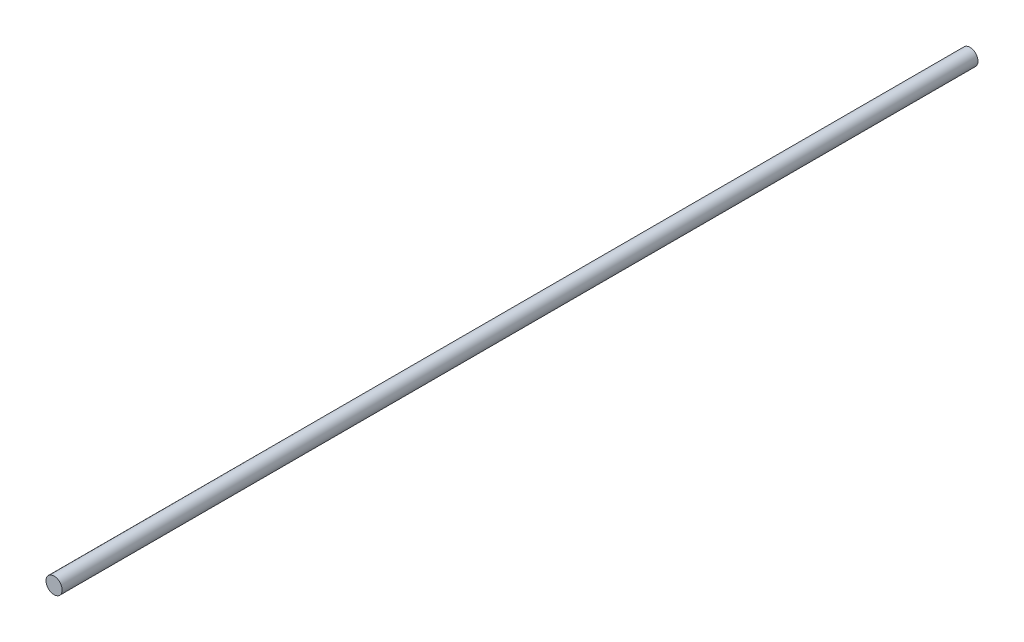
ISO-10303-21;
HEADER;
FILE_DESCRIPTION(('STEP AP214'),'2;1');
FILE_NAME('part.step','',(''),(''),'','','');
FILE_SCHEMA(('AUTOMOTIVE_DESIGN { 1 0 10303 214 1 1 1 1 }'));
ENDSEC;
DATA;
#1=APPLICATION_CONTEXT('core data for automotive mechanical design processes');
#2=APPLICATION_PROTOCOL_DEFINITION('international standard','automotive_design',2000,#1);
#3=PRODUCT_CONTEXT('',#1,'mechanical');
#4=PRODUCT('Part','Part','',(#3));
#5=PRODUCT_RELATED_PRODUCT_CATEGORY('part','',(#4));
#6=PRODUCT_DEFINITION_FORMATION('','',#4);
#7=PRODUCT_DEFINITION_CONTEXT('part definition',#1,'design');
#8=PRODUCT_DEFINITION('design','',#6,#7);
#9=PRODUCT_DEFINITION_SHAPE('','',#8);
#10=(LENGTH_UNIT() NAMED_UNIT(*) SI_UNIT(.MILLI.,.METRE.));
#11=(NAMED_UNIT(*) PLANE_ANGLE_UNIT() SI_UNIT($,.RADIAN.));
#12=(NAMED_UNIT(*) SI_UNIT($,.STERADIAN.) SOLID_ANGLE_UNIT());
#13=UNCERTAINTY_MEASURE_WITH_UNIT(LENGTH_MEASURE(1.E-05),#10,'distance_accuracy_value','');
#14=(GEOMETRIC_REPRESENTATION_CONTEXT(3) GLOBAL_UNCERTAINTY_ASSIGNED_CONTEXT((#13)) GLOBAL_UNIT_ASSIGNED_CONTEXT((#10,
#11,#12)) REPRESENTATION_CONTEXT('',''));
#15=CARTESIAN_POINT('',(0.,0.,0.));
#16=DIRECTION('',(0.,0.,1.));
#17=DIRECTION('',(1.,0.,0.));
#18=AXIS2_PLACEMENT_3D('',#15,#16,#17);
#19=CARTESIAN_POINT('',(0.,0.,680.));
#20=DIRECTION('',(0.,0.,-1.));
#21=DIRECTION('',(-1.,0.,0.));
#22=AXIS2_PLACEMENT_3D('',#19,#20,#21);
#23=CYLINDRICAL_SURFACE('',#22,6.);
#24=CARTESIAN_POINT('',(0.,0.,680.));
#25=DIRECTION('',(0.,0.,1.));
#26=DIRECTION('',(1.,0.,0.));
#27=AXIS2_PLACEMENT_3D('',#24,#25,#26);
#28=CIRCLE('',#27,6.);
#29=CARTESIAN_POINT('',(6.,0.,680.));
#30=VERTEX_POINT('',#29);
#31=EDGE_CURVE('E10',#30,#30,#28,.T.);
#32=ORIENTED_EDGE('',*,*,#31,.F.);
#33=EDGE_LOOP('',(#32));
#34=FACE_BOUND('',#33,.T.);
#35=CARTESIAN_POINT('',(0.,0.,0.));
#36=DIRECTION('',(0.,0.,1.));
#37=DIRECTION('',(1.,0.,0.));
#38=AXIS2_PLACEMENT_3D('',#35,#36,#37);
#39=CIRCLE('',#38,6.);
#40=CARTESIAN_POINT('',(6.,0.,0.));
#41=VERTEX_POINT('',#40);
#42=EDGE_CURVE('E46',#41,#41,#39,.T.);
#43=ORIENTED_EDGE('',*,*,#42,.T.);
#44=EDGE_LOOP('',(#43));
#45=FACE_BOUND('',#44,.T.);
#46=ADVANCED_FACE('F43',(#34,#45),#23,.T.);
#47=CARTESIAN_POINT('',(0.,0.,680.));
#48=DIRECTION('',(0.,0.,1.));
#49=DIRECTION('',(1.,0.,0.));
#50=AXIS2_PLACEMENT_3D('',#47,#48,#49);
#51=PLANE('',#50);
#52=ORIENTED_EDGE('',*,*,#31,.T.);
#53=EDGE_LOOP('',(#52));
#54=FACE_BOUND('',#53,.T.);
#55=ADVANCED_FACE('F60',(#54),#51,.T.);
#56=CARTESIAN_POINT('',(0.,0.,0.));
#57=DIRECTION('',(0.,0.,1.));
#58=DIRECTION('',(1.,0.,0.));
#59=AXIS2_PLACEMENT_3D('',#56,#57,#58);
#60=PLANE('',#59);
#61=ORIENTED_EDGE('',*,*,#42,.F.);
#62=EDGE_LOOP('',(#61));
#63=FACE_BOUND('',#62,.T.);
#64=ADVANCED_FACE('F58',(#63),#60,.F.);
#65=CLOSED_SHELL('',(#46,#55,#64));
#66=MANIFOLD_SOLID_BREP('B2',#65);
#67=ADVANCED_BREP_SHAPE_REPRESENTATION('',(#18,#66),#14);
#68=SHAPE_DEFINITION_REPRESENTATION(#9,#67);
ENDSEC;
END-ISO-10303-21;
